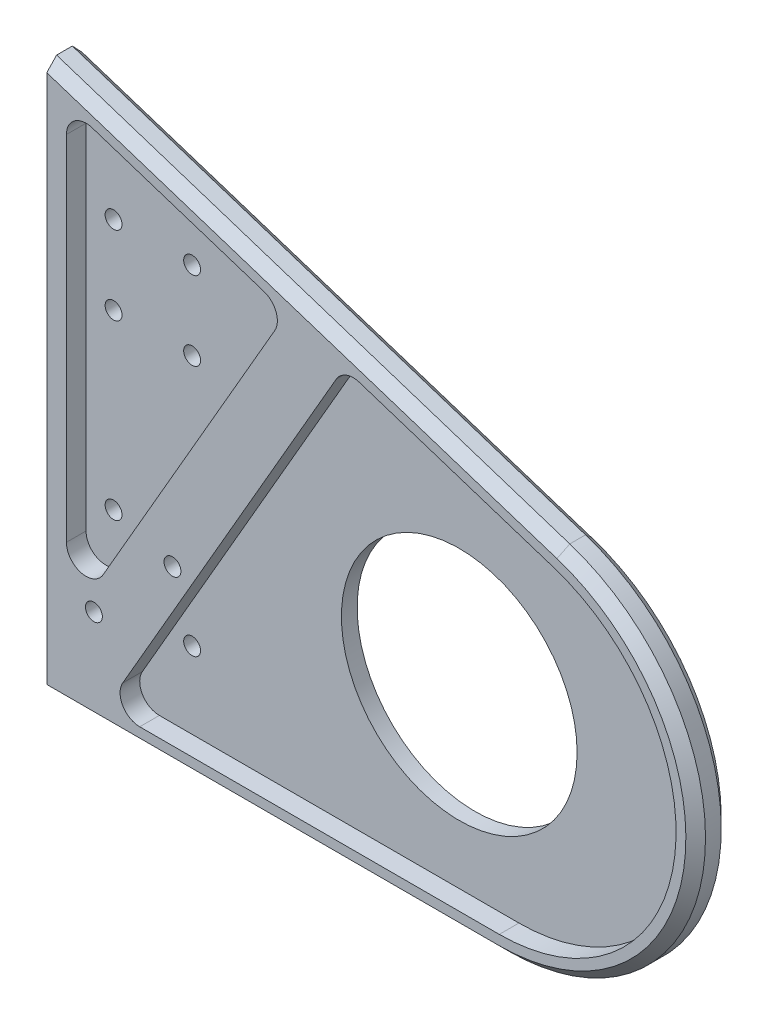
ISO-10303-21;
HEADER;
FILE_DESCRIPTION(('STEP AP214'),'2;1');
FILE_NAME('part.step','',(''),(''),'','','');
FILE_SCHEMA(('AUTOMOTIVE_DESIGN { 1 0 10303 214 1 1 1 1 }'));
ENDSEC;
DATA;
#1=APPLICATION_CONTEXT('core data for automotive mechanical design processes');
#2=APPLICATION_PROTOCOL_DEFINITION('international standard','automotive_design',2000,#1);
#3=PRODUCT_CONTEXT('',#1,'mechanical');
#4=PRODUCT('Part','Part','',(#3));
#5=PRODUCT_RELATED_PRODUCT_CATEGORY('part','',(#4));
#6=PRODUCT_DEFINITION_FORMATION('','',#4);
#7=PRODUCT_DEFINITION_CONTEXT('part definition',#1,'design');
#8=PRODUCT_DEFINITION('design','',#6,#7);
#9=PRODUCT_DEFINITION_SHAPE('','',#8);
#10=(LENGTH_UNIT() NAMED_UNIT(*) SI_UNIT(.MILLI.,.METRE.));
#11=(NAMED_UNIT(*) PLANE_ANGLE_UNIT() SI_UNIT($,.RADIAN.));
#12=(NAMED_UNIT(*) SI_UNIT($,.STERADIAN.) SOLID_ANGLE_UNIT());
#13=UNCERTAINTY_MEASURE_WITH_UNIT(LENGTH_MEASURE(1.E-05),#10,'distance_accuracy_value','');
#14=(GEOMETRIC_REPRESENTATION_CONTEXT(3) GLOBAL_UNCERTAINTY_ASSIGNED_CONTEXT((#13)) GLOBAL_UNIT_ASSIGNED_CONTEXT((#10,
#11,#12)) REPRESENTATION_CONTEXT('',''));
#15=CARTESIAN_POINT('',(0.,0.,0.));
#16=DIRECTION('',(0.,0.,1.));
#17=DIRECTION('',(1.,0.,0.));
#18=AXIS2_PLACEMENT_3D('',#15,#16,#17);
#19=CARTESIAN_POINT('',(0.,0.,8.));
#20=DIRECTION('',(0.,0.,-1.));
#21=DIRECTION('',(-1.,0.,0.));
#22=AXIS2_PLACEMENT_3D('',#19,#20,#21);
#23=PLANE('',#22);
#24=CARTESIAN_POINT('',(64.,49.,8.));
#25=DIRECTION('',(0.,0.,-1.));
#26=DIRECTION('',(-1.,0.,0.));
#27=AXIS2_PLACEMENT_3D('',#24,#25,#26);
#28=CIRCLE('',#27,4.3);
#29=CARTESIAN_POINT('',(59.7,49.,8.));
#30=VERTEX_POINT('',#29);
#31=EDGE_CURVE('E340',#30,#30,#28,.T.);
#32=ORIENTED_EDGE('',*,*,#31,.T.);
#33=EDGE_LOOP('',(#32));
#34=FACE_BOUND('',#33,.T.);
#35=DIRECTION('',(-0.499999999999998,-0.86602540378444,0.));
#36=VECTOR('',#35,1.);
#37=CARTESIAN_POINT('',(30.,10.,8.));
#38=LINE('',#37,#36);
#39=CARTESIAN_POINT('',(147.361565015534,213.276193462705,8.));
#40=VERTEX_POINT('',#39);
#41=CARTESIAN_POINT('',(38.6602540378444,25.,8.));
#42=VERTEX_POINT('',#41);
#43=EDGE_CURVE('E208',#40,#42,#38,.T.);
#44=ORIENTED_EDGE('',*,*,#43,.T.);
#45=CARTESIAN_POINT('',(47.3205080756888,20.,8.));
#46=DIRECTION('',(0.,0.,-1.));
#47=DIRECTION('',(-1.,0.,0.));
#48=AXIS2_PLACEMENT_3D('',#45,#46,#47);
#49=CIRCLE('',#48,10.);
#50=CARTESIAN_POINT('',(47.3205080756887,10.,8.));
#51=VERTEX_POINT('',#50);
#52=EDGE_CURVE('E283',#42,#51,#49,.F.);
#53=ORIENTED_EDGE('',*,*,#52,.T.);
#54=DIRECTION('',(1.,0.,0.));
#55=VECTOR('',#54,1.);
#56=CARTESIAN_POINT('',(30.,10.,8.));
#57=LINE('',#56,#55);
#58=CARTESIAN_POINT('',(230.376238941563,10.,8.));
#59=VERTEX_POINT('',#58);
#60=EDGE_CURVE('E211',#51,#59,#57,.T.);
#61=ORIENTED_EDGE('',*,*,#60,.T.);
#62=CARTESIAN_POINT('',(230.376238941563,100.,8.));
#63=DIRECTION('',(0.,0.,1.));
#64=DIRECTION('',(1.,0.,0.));
#65=AXIS2_PLACEMENT_3D('',#62,#63,#64);
#66=CIRCLE('',#65,90.);
#67=CARTESIAN_POINT('',(258.187768435309,185.595086466564,8.));
#68=VERTEX_POINT('',#67);
#69=EDGE_CURVE('E197',#59,#68,#66,.T.);
#70=ORIENTED_EDGE('',*,*,#69,.T.);
#71=DIRECTION('',(-0.951056516295152,0.309016994374952,0.));
#72=VECTOR('',#71,1.);
#73=CARTESIAN_POINT('',(151.410485181509,220.289128905964,8.));
#74=LINE('',#73,#72);
#75=CARTESIAN_POINT('',(159.111988997128,217.786758625656,8.));
#76=VERTEX_POINT('',#75);
#77=EDGE_CURVE('E215',#68,#76,#74,.T.);
#78=ORIENTED_EDGE('',*,*,#77,.T.);
#79=CARTESIAN_POINT('',(156.021819053379,208.276193462705,8.));
#80=DIRECTION('',(0.,0.,-1.));
#81=DIRECTION('',(-1.,0.,0.));
#82=AXIS2_PLACEMENT_3D('',#79,#80,#81);
#83=CIRCLE('',#82,10.);
#84=EDGE_CURVE('E281',#76,#40,#83,.F.);
#85=ORIENTED_EDGE('',*,*,#84,.T.);
#86=EDGE_LOOP('',(#44,#53,#61,#70,#78,#85));
#87=FACE_BOUND('',#86,.T.);
#88=CARTESIAN_POINT('',(200.,99.9999999999999,8.));
#89=DIRECTION('',(0.,0.,1.));
#90=DIRECTION('',(1.,0.,0.));
#91=AXIS2_PLACEMENT_3D('',#88,#89,#90);
#92=CIRCLE('',#91,60.);
#93=CARTESIAN_POINT('',(260.,99.9999999999999,8.));
#94=VERTEX_POINT('',#93);
#95=EDGE_CURVE('E240',#94,#94,#92,.T.);
#96=ORIENTED_EDGE('',*,*,#95,.F.);
#97=EDGE_LOOP('',(#96));
#98=FACE_BOUND('',#97,.T.);
#99=ADVANCED_FACE('F37',(#34,#87,#98),#23,.F.);
#100=CARTESIAN_POINT('',(0.,0.,0.));
#101=DIRECTION('',(0.,0.,-1.));
#102=DIRECTION('',(-1.,0.,0.));
#103=AXIS2_PLACEMENT_3D('',#100,#101,#102);
#104=PLANE('',#103);
#105=CARTESIAN_POINT('',(64.,89.,0.));
#106=DIRECTION('',(0.,0.,-1.));
#107=DIRECTION('',(-1.,0.,0.));
#108=AXIS2_PLACEMENT_3D('',#105,#106,#107);
#109=CIRCLE('',#108,4.3);
#110=CARTESIAN_POINT('',(59.7,89.,0.));
#111=VERTEX_POINT('',#110);
#112=EDGE_CURVE('E711',#111,#111,#109,.T.);
#113=ORIENTED_EDGE('',*,*,#112,.F.);
#114=EDGE_LOOP('',(#113));
#115=FACE_BOUND('',#114,.T.);
#116=CARTESIAN_POINT('',(24.,177.,0.));
#117=DIRECTION('',(0.,0.,-1.));
#118=DIRECTION('',(-1.,0.,0.));
#119=AXIS2_PLACEMENT_3D('',#116,#117,#118);
#120=CIRCLE('',#119,4.3);
#121=CARTESIAN_POINT('',(19.7,177.,0.));
#122=VERTEX_POINT('',#121);
#123=EDGE_CURVE('E718',#122,#122,#120,.T.);
#124=ORIENTED_EDGE('',*,*,#123,.F.);
#125=EDGE_LOOP('',(#124));
#126=FACE_BOUND('',#125,.T.);
#127=CARTESIAN_POINT('',(24.,217.,0.));
#128=DIRECTION('',(0.,0.,-1.));
#129=DIRECTION('',(-1.,0.,0.));
#130=AXIS2_PLACEMENT_3D('',#127,#128,#129);
#131=CIRCLE('',#130,4.3);
#132=CARTESIAN_POINT('',(19.7,217.,0.));
#133=VERTEX_POINT('',#132);
#134=EDGE_CURVE('E721',#133,#133,#131,.T.);
#135=ORIENTED_EDGE('',*,*,#134,.F.);
#136=EDGE_LOOP('',(#135));
#137=FACE_BOUND('',#136,.T.);
#138=CARTESIAN_POINT('',(64.,177.,0.));
#139=DIRECTION('',(0.,0.,-1.));
#140=DIRECTION('',(-1.,0.,0.));
#141=AXIS2_PLACEMENT_3D('',#138,#139,#140);
#142=CIRCLE('',#141,4.3);
#143=CARTESIAN_POINT('',(59.7,177.,0.));
#144=VERTEX_POINT('',#143);
#145=EDGE_CURVE('E727',#144,#144,#142,.T.);
#146=ORIENTED_EDGE('',*,*,#145,.F.);
#147=EDGE_LOOP('',(#146));
#148=FACE_BOUND('',#147,.T.);
#149=CARTESIAN_POINT('',(24.,49.,0.));
#150=DIRECTION('',(0.,0.,-1.));
#151=DIRECTION('',(-1.,0.,0.));
#152=AXIS2_PLACEMENT_3D('',#149,#150,#151);
#153=CIRCLE('',#152,4.3);
#154=CARTESIAN_POINT('',(19.7,49.,0.));
#155=VERTEX_POINT('',#154);
#156=EDGE_CURVE('E714',#155,#155,#153,.T.);
#157=ORIENTED_EDGE('',*,*,#156,.F.);
#158=EDGE_LOOP('',(#157));
#159=FACE_BOUND('',#158,.T.);
#160=CARTESIAN_POINT('',(64.,49.,0.));
#161=DIRECTION('',(0.,0.,-1.));
#162=DIRECTION('',(-1.,0.,0.));
#163=AXIS2_PLACEMENT_3D('',#160,#161,#162);
#164=CIRCLE('',#163,4.3);
#165=CARTESIAN_POINT('',(59.7,49.,0.));
#166=VERTEX_POINT('',#165);
#167=EDGE_CURVE('E705',#166,#166,#164,.T.);
#168=ORIENTED_EDGE('',*,*,#167,.F.);
#169=EDGE_LOOP('',(#168));
#170=FACE_BOUND('',#169,.T.);
#171=CARTESIAN_POINT('',(24.,89.,0.));
#172=DIRECTION('',(0.,0.,-1.));
#173=DIRECTION('',(-1.,0.,0.));
#174=AXIS2_PLACEMENT_3D('',#171,#172,#173);
#175=CIRCLE('',#174,4.3);
#176=CARTESIAN_POINT('',(19.7,89.,0.));
#177=VERTEX_POINT('',#176);
#178=EDGE_CURVE('E707',#177,#177,#175,.T.);
#179=ORIENTED_EDGE('',*,*,#178,.F.);
#180=EDGE_LOOP('',(#179));
#181=FACE_BOUND('',#180,.T.);
#182=CARTESIAN_POINT('',(64.,217.,0.));
#183=DIRECTION('',(0.,0.,-1.));
#184=DIRECTION('',(-1.,0.,0.));
#185=AXIS2_PLACEMENT_3D('',#182,#183,#184);
#186=CIRCLE('',#185,4.3);
#187=CARTESIAN_POINT('',(59.7,217.,0.));
#188=VERTEX_POINT('',#187);
#189=EDGE_CURVE('E347',#188,#188,#186,.T.);
#190=ORIENTED_EDGE('',*,*,#189,.F.);
#191=EDGE_LOOP('',(#190));
#192=FACE_BOUND('',#191,.T.);
#193=DIRECTION('',(0.,-1.,0.));
#194=VECTOR('',#193,1.);
#195=CARTESIAN_POINT('',(0.,0.,0.));
#196=LINE('',#195,#194);
#197=CARTESIAN_POINT('',(0.,274.742688878809,0.));
#198=VERTEX_POINT('',#197);
#199=CARTESIAN_POINT('',(0.,5.,0.));
#200=VERTEX_POINT('',#199);
#201=EDGE_CURVE('E243',#198,#200,#196,.T.);
#202=ORIENTED_EDGE('',*,*,#201,.F.);
#203=DIRECTION('',(0.951056516295152,-0.309016994374951,0.));
#204=VECTOR('',#203,1.);
#205=CARTESIAN_POINT('',(259.732853407183,190.350369048039,0.));
#206=LINE('',#205,#204);
#207=CARTESIAN_POINT('',(259.732853407183,190.350369048039,0.));
#208=VERTEX_POINT('',#207);
#209=EDGE_CURVE('E321',#198,#208,#206,.T.);
#210=ORIENTED_EDGE('',*,*,#209,.T.);
#211=CARTESIAN_POINT('',(230.376238941563,100.,0.));
#212=DIRECTION('',(0.,0.,-1.));
#213=DIRECTION('',(-1.,0.,0.));
#214=AXIS2_PLACEMENT_3D('',#211,#212,#213);
#215=CIRCLE('',#214,95.);
#216=CARTESIAN_POINT('',(230.376238941563,5.,0.));
#217=VERTEX_POINT('',#216);
#218=EDGE_CURVE('E317',#208,#217,#215,.T.);
#219=ORIENTED_EDGE('',*,*,#218,.T.);
#220=DIRECTION('',(-1.,0.,0.));
#221=VECTOR('',#220,1.);
#222=CARTESIAN_POINT('',(0.,5.,0.));
#223=LINE('',#222,#221);
#224=EDGE_CURVE('E319',#217,#200,#223,.T.);
#225=ORIENTED_EDGE('',*,*,#224,.T.);
#226=EDGE_LOOP('',(#202,#210,#219,#225));
#227=FACE_BOUND('',#226,.T.);
#228=CARTESIAN_POINT('',(200.,99.9999999999999,0.));
#229=DIRECTION('',(0.,0.,1.));
#230=DIRECTION('',(1.,0.,0.));
#231=AXIS2_PLACEMENT_3D('',#228,#229,#230);
#232=CIRCLE('',#231,60.);
#233=CARTESIAN_POINT('',(260.,99.9999999999999,0.));
#234=VERTEX_POINT('',#233);
#235=EDGE_CURVE('E239',#234,#234,#232,.T.);
#236=ORIENTED_EDGE('',*,*,#235,.T.);
#237=EDGE_LOOP('',(#236));
#238=FACE_BOUND('',#237,.T.);
#239=ADVANCED_FACE('F396',(#115,#126,#137,#148,#159,#170,#181,#192,#227,#238),#104,.T.);
#240=CARTESIAN_POINT('',(861.751390409059,0.,8.));
#241=DIRECTION('',(0.,1.,0.));
#242=DIRECTION('',(-1.,0.,0.));
#243=AXIS2_PLACEMENT_3D('',#240,#241,#242);
#244=PLANE('',#243);
#245=DIRECTION('',(0.,0.,-1.));
#246=VECTOR('',#245,1.);
#247=CARTESIAN_POINT('',(0.,0.,8.));
#248=LINE('',#247,#246);
#249=CARTESIAN_POINT('',(0.,0.,12.9999999999999));
#250=VERTEX_POINT('',#249);
#251=CARTESIAN_POINT('',(0.,0.,5.00000000000002));
#252=VERTEX_POINT('',#251);
#253=EDGE_CURVE('E248',#250,#252,#248,.T.);
#254=ORIENTED_EDGE('',*,*,#253,.T.);
#255=DIRECTION('',(1.,0.,0.));
#256=VECTOR('',#255,1.);
#257=CARTESIAN_POINT('',(230.376238941563,0.,5.00000000000002));
#258=LINE('',#257,#256);
#259=CARTESIAN_POINT('',(230.376238941563,0.,5.00000000000002));
#260=VERTEX_POINT('',#259);
#261=EDGE_CURVE('E325',#252,#260,#258,.T.);
#262=ORIENTED_EDGE('',*,*,#261,.T.);
#263=DIRECTION('',(0.,0.,-1.));
#264=VECTOR('',#263,1.);
#265=CARTESIAN_POINT('',(230.376238941563,0.,8.));
#266=LINE('',#265,#264);
#267=CARTESIAN_POINT('',(230.376238941563,0.,12.9999999999999));
#268=VERTEX_POINT('',#267);
#269=EDGE_CURVE('E257',#260,#268,#266,.F.);
#270=ORIENTED_EDGE('',*,*,#269,.T.);
#271=DIRECTION('',(-1.,0.,0.));
#272=VECTOR('',#271,1.);
#273=CARTESIAN_POINT('',(0.,0.,12.9999999999999));
#274=LINE('',#273,#272);
#275=EDGE_CURVE('E323',#268,#250,#274,.T.);
#276=ORIENTED_EDGE('',*,*,#275,.T.);
#277=EDGE_LOOP('',(#254,#262,#270,#276));
#278=FACE_BOUND('',#277,.T.);
#279=ADVANCED_FACE('F401',(#278),#244,.F.);
#280=CARTESIAN_POINT('',(0.,280.,8.));
#281=DIRECTION('',(-0.309016994374951,-0.951056516295152,0.));
#282=DIRECTION('',(0.951056516295152,-0.309016994374951,0.));
#283=AXIS2_PLACEMENT_3D('',#280,#281,#282);
#284=PLANE('',#283);
#285=DIRECTION('',(0.,0.,-1.));
#286=VECTOR('',#285,1.);
#287=CARTESIAN_POINT('',(261.277938379058,195.105651629515,8.));
#288=LINE('',#287,#286);
#289=CARTESIAN_POINT('',(261.277938379058,195.105651629515,12.9999999999999));
#290=VERTEX_POINT('',#289);
#291=CARTESIAN_POINT('',(261.277938379058,195.105651629515,5.00000000000002));
#292=VERTEX_POINT('',#291);
#293=EDGE_CURVE('E254',#290,#292,#288,.T.);
#294=ORIENTED_EDGE('',*,*,#293,.T.);
#295=DIRECTION('',(-0.951056516295152,0.309016994374951,0.));
#296=VECTOR('',#295,1.);
#297=CARTESIAN_POINT('',(0.,280.,5.00000000000002));
#298=LINE('',#297,#296);
#299=CARTESIAN_POINT('',(0.,280.,5.00000000000002));
#300=VERTEX_POINT('',#299);
#301=EDGE_CURVE('E306',#292,#300,#298,.T.);
#302=ORIENTED_EDGE('',*,*,#301,.T.);
#303=DIRECTION('',(0.,0.,-1.));
#304=VECTOR('',#303,1.);
#305=CARTESIAN_POINT('',(0.,280.,8.));
#306=LINE('',#305,#304);
#307=CARTESIAN_POINT('',(0.,280.,12.9999999999999));
#308=VERTEX_POINT('',#307);
#309=EDGE_CURVE('E251',#308,#300,#306,.T.);
#310=ORIENTED_EDGE('',*,*,#309,.F.);
#311=DIRECTION('',(0.951056516295152,-0.309016994374951,0.));
#312=VECTOR('',#311,1.);
#313=CARTESIAN_POINT('',(261.277938379058,195.105651629515,12.9999999999999));
#314=LINE('',#313,#312);
#315=EDGE_CURVE('E304',#308,#290,#314,.T.);
#316=ORIENTED_EDGE('',*,*,#315,.T.);
#317=EDGE_LOOP('',(#294,#302,#310,#316));
#318=FACE_BOUND('',#317,.T.);
#319=ADVANCED_FACE('F411',(#318),#284,.F.);
#320=CARTESIAN_POINT('',(0.,0.,8.));
#321=DIRECTION('',(1.,0.,0.));
#322=DIRECTION('',(0.,0.,-1.));
#323=AXIS2_PLACEMENT_3D('',#320,#321,#322);
#324=PLANE('',#323);
#325=ORIENTED_EDGE('',*,*,#309,.T.);
#326=DIRECTION('',(0.,-0.724617040067446,-0.689151757774653));
#327=VECTOR('',#326,1.);
#328=CARTESIAN_POINT('',(0.,280.,5.00000000000002));
#329=LINE('',#328,#327);
#330=EDGE_CURVE('E315',#300,#198,#329,.T.);
#331=ORIENTED_EDGE('',*,*,#330,.T.);
#332=ORIENTED_EDGE('',*,*,#201,.T.);
#333=DIRECTION('',(0.,-0.707106781186547,0.707106781186549));
#334=VECTOR('',#333,1.);
#335=CARTESIAN_POINT('',(0.,0.,5.00000000000002));
#336=LINE('',#335,#334);
#337=EDGE_CURVE('E313',#200,#252,#336,.T.);
#338=ORIENTED_EDGE('',*,*,#337,.T.);
#339=ORIENTED_EDGE('',*,*,#253,.F.);
#340=DIRECTION('',(0.,0.707106781186551,0.707106781186545));
#341=VECTOR('',#340,1.);
#342=CARTESIAN_POINT('',(0.,5.00000000000012,18.));
#343=LINE('',#342,#341);
#344=CARTESIAN_POINT('',(0.,5.00000000000012,18.));
#345=VERTEX_POINT('',#344);
#346=EDGE_CURVE('E311',#250,#345,#343,.T.);
#347=ORIENTED_EDGE('',*,*,#346,.T.);
#348=DIRECTION('',(0.,-1.,0.));
#349=VECTOR('',#348,1.);
#350=CARTESIAN_POINT('',(0.,280.,18.));
#351=LINE('',#350,#349);
#352=CARTESIAN_POINT('',(0.,274.742688878809,18.));
#353=VERTEX_POINT('',#352);
#354=EDGE_CURVE('E229',#353,#345,#351,.T.);
#355=ORIENTED_EDGE('',*,*,#354,.F.);
#356=DIRECTION('',(0.,0.724617040067451,-0.689151757774647));
#357=VECTOR('',#356,1.);
#358=CARTESIAN_POINT('',(0.,230.430825762735,60.1430861657201));
#359=LINE('',#358,#357);
#360=EDGE_CURVE('E309',#353,#308,#359,.T.);
#361=ORIENTED_EDGE('',*,*,#360,.T.);
#362=EDGE_LOOP('',(#325,#331,#332,#338,#339,#347,#355,#361));
#363=FACE_BOUND('',#362,.T.);
#364=ADVANCED_FACE('F408',(#363),#324,.F.);
#365=CARTESIAN_POINT('',(200.,99.9999999999999,8.));
#366=DIRECTION('',(0.,0.,-1.));
#367=DIRECTION('',(-1.,0.,0.));
#368=AXIS2_PLACEMENT_3D('',#365,#366,#367);
#369=CYLINDRICAL_SURFACE('',#368,60.);
#370=ORIENTED_EDGE('',*,*,#95,.T.);
#371=EDGE_LOOP('',(#370));
#372=FACE_BOUND('',#371,.T.);
#373=ORIENTED_EDGE('',*,*,#235,.F.);
#374=EDGE_LOOP('',(#373));
#375=FACE_BOUND('',#374,.T.);
#376=ADVANCED_FACE('F405',(#372,#375),#369,.F.);
#377=CARTESIAN_POINT('',(230.376238941563,100.,8.));
#378=DIRECTION('',(0.,0.,-1.));
#379=DIRECTION('',(-1.,0.,0.));
#380=AXIS2_PLACEMENT_3D('',#377,#378,#379);
#381=CYLINDRICAL_SURFACE('',#380,100.);
#382=ORIENTED_EDGE('',*,*,#269,.F.);
#383=CARTESIAN_POINT('',(230.376238941563,100.,5.00000000000002));
#384=DIRECTION('',(0.,0.,-1.));
#385=DIRECTION('',(-1.,0.,0.));
#386=AXIS2_PLACEMENT_3D('',#383,#384,#385);
#387=CIRCLE('',#386,100.);
#388=EDGE_CURVE('E329',#260,#292,#387,.F.);
#389=ORIENTED_EDGE('',*,*,#388,.T.);
#390=ORIENTED_EDGE('',*,*,#293,.F.);
#391=CARTESIAN_POINT('',(230.376238941563,100.,12.9999999999999));
#392=DIRECTION('',(0.,0.,1.));
#393=DIRECTION('',(1.,0.,0.));
#394=AXIS2_PLACEMENT_3D('',#391,#392,#393);
#395=CIRCLE('',#394,100.);
#396=EDGE_CURVE('E327',#290,#268,#395,.F.);
#397=ORIENTED_EDGE('',*,*,#396,.T.);
#398=EDGE_LOOP('',(#382,#389,#390,#397));
#399=FACE_BOUND('',#398,.T.);
#400=ADVANCED_FACE('F419',(#399),#381,.T.);
#401=CARTESIAN_POINT('',(230.376238941563,100.,18.));
#402=DIRECTION('',(0.,0.,1.));
#403=DIRECTION('',(1.,0.,0.));
#404=AXIS2_PLACEMENT_3D('',#401,#402,#403);
#405=PLANE('',#404);
#406=CARTESIAN_POINT('',(64.,89.,18.));
#407=DIRECTION('',(0.,0.,-1.));
#408=DIRECTION('',(-1.,0.,0.));
#409=AXIS2_PLACEMENT_3D('',#406,#407,#408);
#410=CIRCLE('',#409,4.3);
#411=CARTESIAN_POINT('',(59.7,89.,18.));
#412=VERTEX_POINT('',#411);
#413=EDGE_CURVE('E722',#412,#412,#410,.T.);
#414=ORIENTED_EDGE('',*,*,#413,.T.);
#415=EDGE_LOOP('',(#414));
#416=FACE_BOUND('',#415,.T.);
#417=CARTESIAN_POINT('',(24.,49.,18.));
#418=DIRECTION('',(0.,0.,-1.));
#419=DIRECTION('',(-1.,0.,0.));
#420=AXIS2_PLACEMENT_3D('',#417,#418,#419);
#421=CIRCLE('',#420,4.3);
#422=CARTESIAN_POINT('',(19.7,49.,18.));
#423=VERTEX_POINT('',#422);
#424=EDGE_CURVE('E708',#423,#423,#421,.T.);
#425=ORIENTED_EDGE('',*,*,#424,.T.);
#426=EDGE_LOOP('',(#425));
#427=FACE_BOUND('',#426,.T.);
#428=ORIENTED_EDGE('',*,*,#354,.T.);
#429=DIRECTION('',(1.,0.,0.));
#430=VECTOR('',#429,1.);
#431=CARTESIAN_POINT('',(230.376238941563,5.00000000000012,18.));
#432=LINE('',#431,#430);
#433=CARTESIAN_POINT('',(230.376238941563,5.0000000000001,18.));
#434=VERTEX_POINT('',#433);
#435=EDGE_CURVE('E11',#345,#434,#432,.T.);
#436=ORIENTED_EDGE('',*,*,#435,.T.);
#437=CARTESIAN_POINT('',(230.376238941563,100.,18.));
#438=DIRECTION('',(0.,0.,1.));
#439=DIRECTION('',(1.,0.,0.));
#440=AXIS2_PLACEMENT_3D('',#437,#438,#439);
#441=CIRCLE('',#440,94.9999999999999);
#442=CARTESIAN_POINT('',(259.732853407183,190.350369048039,18.));
#443=VERTEX_POINT('',#442);
#444=EDGE_CURVE('E54',#434,#443,#441,.T.);
#445=ORIENTED_EDGE('',*,*,#444,.T.);
#446=DIRECTION('',(-0.951056516295152,0.309016994374951,0.));
#447=VECTOR('',#446,1.);
#448=CARTESIAN_POINT('',(-1.54508497187479,275.244717418524,18.));
#449=LINE('',#448,#447);
#450=EDGE_CURVE('E47',#443,#353,#449,.T.);
#451=ORIENTED_EDGE('',*,*,#450,.T.);
#452=EDGE_LOOP('',(#428,#436,#445,#451));
#453=FACE_BOUND('',#452,.T.);
#454=DIRECTION('',(0.,-1.,0.));
#455=VECTOR('',#454,1.);
#456=CARTESIAN_POINT('',(10.,266.236180795288,18.));
#457=LINE('',#456,#455);
#458=CARTESIAN_POINT('',(10.,252.472361590576,18.));
#459=VERTEX_POINT('',#458);
#460=CARTESIAN_POINT('',(10.,72.6794919243115,18.));
#461=VERTEX_POINT('',#460);
#462=EDGE_CURVE('E222',#459,#461,#457,.T.);
#463=ORIENTED_EDGE('',*,*,#462,.F.);
#464=CARTESIAN_POINT('',(20.,252.472361590576,18.));
#465=DIRECTION('',(0.,0.,1.));
#466=DIRECTION('',(1.,0.,0.));
#467=AXIS2_PLACEMENT_3D('',#464,#465,#466);
#468=CIRCLE('',#467,10.);
#469=CARTESIAN_POINT('',(23.0901699437495,261.982926753528,18.));
#470=VERTEX_POINT('',#469);
#471=EDGE_CURVE('E302',#459,#470,#468,.F.);
#472=ORIENTED_EDGE('',*,*,#471,.T.);
#473=DIRECTION('',(-0.951056516295152,0.309016994374951,0.));
#474=VECTOR('',#473,1.);
#475=CARTESIAN_POINT('',(10.,266.236180795288,18.));
#476=LINE('',#475,#474);
#477=CARTESIAN_POINT('',(110.496804766156,233.582789518291,18.));
#478=VERTEX_POINT('',#477);
#479=EDGE_CURVE('E219',#478,#470,#476,.T.);
#480=ORIENTED_EDGE('',*,*,#479,.F.);
#481=CARTESIAN_POINT('',(107.406634822406,224.072224355339,18.));
#482=DIRECTION('',(0.,0.,1.));
#483=DIRECTION('',(1.,0.,0.));
#484=AXIS2_PLACEMENT_3D('',#481,#482,#483);
#485=CIRCLE('',#484,10.);
#486=CARTESIAN_POINT('',(116.066888860251,219.072224355339,18.));
#487=VERTEX_POINT('',#486);
#488=EDGE_CURVE('E298',#478,#487,#485,.F.);
#489=ORIENTED_EDGE('',*,*,#488,.T.);
#490=DIRECTION('',(0.499999999999998,0.86602540378444,0.));
#491=VECTOR('',#490,1.);
#492=CARTESIAN_POINT('',(10.,35.3589838486225,18.));
#493=LINE('',#492,#491);
#494=CARTESIAN_POINT('',(28.6602540378444,67.6794919243115,18.));
#495=VERTEX_POINT('',#494);
#496=EDGE_CURVE('E226',#495,#487,#493,.T.);
#497=ORIENTED_EDGE('',*,*,#496,.F.);
#498=CARTESIAN_POINT('',(20.,72.6794919243115,18.));
#499=DIRECTION('',(0.,0.,1.));
#500=DIRECTION('',(1.,0.,0.));
#501=AXIS2_PLACEMENT_3D('',#498,#499,#500);
#502=CIRCLE('',#501,10.);
#503=EDGE_CURVE('E294',#495,#461,#502,.F.);
#504=ORIENTED_EDGE('',*,*,#503,.T.);
#505=EDGE_LOOP('',(#463,#472,#480,#489,#497,#504));
#506=FACE_BOUND('',#505,.T.);
#507=DIRECTION('',(1.,0.,0.));
#508=VECTOR('',#507,1.);
#509=CARTESIAN_POINT('',(30.,10.,18.));
#510=LINE('',#509,#508);
#511=CARTESIAN_POINT('',(47.3205080756887,10.,18.));
#512=VERTEX_POINT('',#511);
#513=CARTESIAN_POINT('',(230.376238941563,10.,18.));
#514=VERTEX_POINT('',#513);
#515=EDGE_CURVE('E178',#512,#514,#510,.T.);
#516=ORIENTED_EDGE('',*,*,#515,.F.);
#517=CARTESIAN_POINT('',(47.3205080756888,20.,18.));
#518=DIRECTION('',(0.,0.,1.));
#519=DIRECTION('',(1.,0.,0.));
#520=AXIS2_PLACEMENT_3D('',#517,#518,#519);
#521=CIRCLE('',#520,10.);
#522=CARTESIAN_POINT('',(38.6602540378444,25.,18.));
#523=VERTEX_POINT('',#522);
#524=EDGE_CURVE('E296',#512,#523,#521,.F.);
#525=ORIENTED_EDGE('',*,*,#524,.T.);
#526=DIRECTION('',(-0.499999999999998,-0.86602540378444,0.));
#527=VECTOR('',#526,1.);
#528=CARTESIAN_POINT('',(30.,10.,18.));
#529=LINE('',#528,#527);
#530=CARTESIAN_POINT('',(147.361565015534,213.276193462705,18.));
#531=VERTEX_POINT('',#530);
#532=EDGE_CURVE('E190',#531,#523,#529,.T.);
#533=ORIENTED_EDGE('',*,*,#532,.F.);
#534=CARTESIAN_POINT('',(156.021819053379,208.276193462705,18.));
#535=DIRECTION('',(0.,0.,1.));
#536=DIRECTION('',(1.,0.,0.));
#537=AXIS2_PLACEMENT_3D('',#534,#535,#536);
#538=CIRCLE('',#537,10.);
#539=CARTESIAN_POINT('',(159.111988997128,217.786758625656,18.));
#540=VERTEX_POINT('',#539);
#541=EDGE_CURVE('E300',#531,#540,#538,.F.);
#542=ORIENTED_EDGE('',*,*,#541,.T.);
#543=DIRECTION('',(-0.951056516295152,0.309016994374952,0.));
#544=VECTOR('',#543,1.);
#545=CARTESIAN_POINT('',(151.410485181509,220.289128905964,18.));
#546=LINE('',#545,#544);
#547=CARTESIAN_POINT('',(258.187768435309,185.595086466564,18.));
#548=VERTEX_POINT('',#547);
#549=EDGE_CURVE('E203',#548,#540,#546,.T.);
#550=ORIENTED_EDGE('',*,*,#549,.F.);
#551=CARTESIAN_POINT('',(230.376238941563,100.,18.));
#552=DIRECTION('',(0.,0.,1.));
#553=DIRECTION('',(1.,0.,0.));
#554=AXIS2_PLACEMENT_3D('',#551,#552,#553);
#555=CIRCLE('',#554,90.);
#556=EDGE_CURVE('E189',#514,#548,#555,.T.);
#557=ORIENTED_EDGE('',*,*,#556,.F.);
#558=EDGE_LOOP('',(#516,#525,#533,#542,#550,#557));
#559=FACE_BOUND('',#558,.T.);
#560=ADVANCED_FACE('F201',(#416,#427,#453,#506,#559),#405,.T.);
#561=CARTESIAN_POINT('',(10.,266.236180795288,18.));
#562=DIRECTION('',(-0.309016994374951,-0.951056516295152,0.));
#563=DIRECTION('',(0.951056516295152,-0.309016994374951,0.));
#564=AXIS2_PLACEMENT_3D('',#561,#562,#563);
#565=PLANE('',#564);
#566=DIRECTION('',(-0.951056516295152,0.309016994374951,0.));
#567=VECTOR('',#566,1.);
#568=CARTESIAN_POINT('',(10.,266.236180795288,8.));
#569=LINE('',#568,#567);
#570=CARTESIAN_POINT('',(110.496804766156,233.582789518291,8.));
#571=VERTEX_POINT('',#570);
#572=CARTESIAN_POINT('',(23.0901699437495,261.982926753528,8.));
#573=VERTEX_POINT('',#572);
#574=EDGE_CURVE('E198',#571,#573,#569,.T.);
#575=ORIENTED_EDGE('',*,*,#574,.F.);
#576=DIRECTION('',(0.,0.,-1.));
#577=VECTOR('',#576,1.);
#578=CARTESIAN_POINT('',(110.496804766156,233.582789518291,18.));
#579=LINE('',#578,#577);
#580=EDGE_CURVE('E289',#571,#478,#579,.F.);
#581=ORIENTED_EDGE('',*,*,#580,.T.);
#582=ORIENTED_EDGE('',*,*,#479,.T.);
#583=DIRECTION('',(0.,0.,-1.));
#584=VECTOR('',#583,1.);
#585=CARTESIAN_POINT('',(23.0901699437495,261.982926753528,8.));
#586=LINE('',#585,#584);
#587=EDGE_CURVE('E286',#470,#573,#586,.T.);
#588=ORIENTED_EDGE('',*,*,#587,.T.);
#589=EDGE_LOOP('',(#575,#581,#582,#588));
#590=FACE_BOUND('',#589,.T.);
#591=ADVANCED_FACE('F520',(#590),#565,.T.);
#592=CARTESIAN_POINT('',(10.,266.236180795288,18.));
#593=DIRECTION('',(1.,0.,0.));
#594=DIRECTION('',(0.,1.,0.));
#595=AXIS2_PLACEMENT_3D('',#592,#593,#594);
#596=PLANE('',#595);
#597=ORIENTED_EDGE('',*,*,#462,.T.);
#598=DIRECTION('',(0.,0.,-1.));
#599=VECTOR('',#598,1.);
#600=CARTESIAN_POINT('',(10.,72.6794919243115,8.));
#601=LINE('',#600,#599);
#602=CARTESIAN_POINT('',(10.,72.6794919243115,8.));
#603=VERTEX_POINT('',#602);
#604=EDGE_CURVE('E262',#461,#603,#601,.T.);
#605=ORIENTED_EDGE('',*,*,#604,.T.);
#606=DIRECTION('',(0.,-1.,0.));
#607=VECTOR('',#606,1.);
#608=CARTESIAN_POINT('',(10.,266.236180795288,8.));
#609=LINE('',#608,#607);
#610=CARTESIAN_POINT('',(10.,252.472361590576,8.));
#611=VERTEX_POINT('',#610);
#612=EDGE_CURVE('E232',#611,#603,#609,.T.);
#613=ORIENTED_EDGE('',*,*,#612,.F.);
#614=DIRECTION('',(0.,0.,-1.));
#615=VECTOR('',#614,1.);
#616=CARTESIAN_POINT('',(10.,252.472361590576,18.));
#617=LINE('',#616,#615);
#618=EDGE_CURVE('E260',#611,#459,#617,.F.);
#619=ORIENTED_EDGE('',*,*,#618,.T.);
#620=EDGE_LOOP('',(#597,#605,#613,#619));
#621=FACE_BOUND('',#620,.T.);
#622=ADVANCED_FACE('F529',(#621),#596,.T.);
#623=CARTESIAN_POINT('',(10.,35.3589838486225,18.));
#624=DIRECTION('',(-0.86602540378444,0.499999999999998,0.));
#625=DIRECTION('',(-0.499999999999998,-0.86602540378444,0.));
#626=AXIS2_PLACEMENT_3D('',#623,#624,#625);
#627=PLANE('',#626);
#628=DIRECTION('',(0.499999999999998,0.86602540378444,0.));
#629=VECTOR('',#628,1.);
#630=CARTESIAN_POINT('',(10.,35.3589838486225,8.));
#631=LINE('',#630,#629);
#632=CARTESIAN_POINT('',(28.6602540378444,67.6794919243115,8.));
#633=VERTEX_POINT('',#632);
#634=CARTESIAN_POINT('',(116.066888860251,219.072224355339,8.));
#635=VERTEX_POINT('',#634);
#636=EDGE_CURVE('E223',#633,#635,#631,.T.);
#637=ORIENTED_EDGE('',*,*,#636,.F.);
#638=DIRECTION('',(0.,0.,-1.));
#639=VECTOR('',#638,1.);
#640=CARTESIAN_POINT('',(28.6602540378444,67.6794919243115,18.));
#641=LINE('',#640,#639);
#642=EDGE_CURVE('E274',#633,#495,#641,.F.);
#643=ORIENTED_EDGE('',*,*,#642,.T.);
#644=ORIENTED_EDGE('',*,*,#496,.T.);
#645=DIRECTION('',(0.,0.,-1.));
#646=VECTOR('',#645,1.);
#647=CARTESIAN_POINT('',(116.066888860251,219.072224355339,8.));
#648=LINE('',#647,#646);
#649=EDGE_CURVE('E271',#487,#635,#648,.T.);
#650=ORIENTED_EDGE('',*,*,#649,.T.);
#651=EDGE_LOOP('',(#637,#643,#644,#650));
#652=FACE_BOUND('',#651,.T.);
#653=ADVANCED_FACE('F536',(#652),#627,.T.);
#654=CARTESIAN_POINT('',(30.,10.,18.));
#655=DIRECTION('',(0.86602540378444,-0.499999999999998,0.));
#656=DIRECTION('',(0.499999999999998,0.86602540378444,0.));
#657=AXIS2_PLACEMENT_3D('',#654,#655,#656);
#658=PLANE('',#657);
#659=ORIENTED_EDGE('',*,*,#532,.T.);
#660=DIRECTION('',(0.,0.,-1.));
#661=VECTOR('',#660,1.);
#662=CARTESIAN_POINT('',(38.6602540378444,25.,8.));
#663=LINE('',#662,#661);
#664=EDGE_CURVE('E278',#523,#42,#663,.T.);
#665=ORIENTED_EDGE('',*,*,#664,.T.);
#666=ORIENTED_EDGE('',*,*,#43,.F.);
#667=DIRECTION('',(0.,0.,-1.));
#668=VECTOR('',#667,1.);
#669=CARTESIAN_POINT('',(147.361565015534,213.276193462705,18.));
#670=LINE('',#669,#668);
#671=EDGE_CURVE('E276',#40,#531,#670,.F.);
#672=ORIENTED_EDGE('',*,*,#671,.T.);
#673=EDGE_LOOP('',(#659,#665,#666,#672));
#674=FACE_BOUND('',#673,.T.);
#675=ADVANCED_FACE('F369',(#674),#658,.T.);
#676=CARTESIAN_POINT('',(30.,10.,18.));
#677=DIRECTION('',(0.,1.,0.));
#678=DIRECTION('',(-1.,0.,0.));
#679=AXIS2_PLACEMENT_3D('',#676,#677,#678);
#680=PLANE('',#679);
#681=ORIENTED_EDGE('',*,*,#60,.F.);
#682=DIRECTION('',(0.,0.,-1.));
#683=VECTOR('',#682,1.);
#684=CARTESIAN_POINT('',(47.3205080756888,10.,18.));
#685=LINE('',#684,#683);
#686=EDGE_CURVE('E185',#51,#512,#685,.F.);
#687=ORIENTED_EDGE('',*,*,#686,.T.);
#688=ORIENTED_EDGE('',*,*,#515,.T.);
#689=DIRECTION('',(0.,0.,-1.));
#690=VECTOR('',#689,1.);
#691=CARTESIAN_POINT('',(230.376238941563,10.,18.));
#692=LINE('',#691,#690);
#693=EDGE_CURVE('E182',#514,#59,#692,.T.);
#694=ORIENTED_EDGE('',*,*,#693,.T.);
#695=EDGE_LOOP('',(#681,#687,#688,#694));
#696=FACE_BOUND('',#695,.T.);
#697=ADVANCED_FACE('F181',(#696),#680,.T.);
#698=CARTESIAN_POINT('',(230.376238941563,100.,18.));
#699=DIRECTION('',(0.,0.,-1.));
#700=DIRECTION('',(-1.,0.,0.));
#701=AXIS2_PLACEMENT_3D('',#698,#699,#700);
#702=CYLINDRICAL_SURFACE('',#701,90.);
#703=ORIENTED_EDGE('',*,*,#69,.F.);
#704=ORIENTED_EDGE('',*,*,#693,.F.);
#705=ORIENTED_EDGE('',*,*,#556,.T.);
#706=DIRECTION('',(0.,0.,-1.));
#707=VECTOR('',#706,1.);
#708=CARTESIAN_POINT('',(258.187768435309,185.595086466564,18.));
#709=LINE('',#708,#707);
#710=EDGE_CURVE('E199',#548,#68,#709,.T.);
#711=ORIENTED_EDGE('',*,*,#710,.T.);
#712=EDGE_LOOP('',(#703,#704,#705,#711));
#713=FACE_BOUND('',#712,.T.);
#714=ADVANCED_FACE('F194',(#713),#702,.F.);
#715=CARTESIAN_POINT('',(151.410485181509,220.289128905964,18.));
#716=DIRECTION('',(-0.309016994374952,-0.951056516295152,0.));
#717=DIRECTION('',(0.951056516295152,-0.309016994374952,0.));
#718=AXIS2_PLACEMENT_3D('',#715,#716,#717);
#719=PLANE('',#718);
#720=ORIENTED_EDGE('',*,*,#549,.T.);
#721=DIRECTION('',(0.,0.,-1.));
#722=VECTOR('',#721,1.);
#723=CARTESIAN_POINT('',(159.111988997128,217.786758625656,8.));
#724=LINE('',#723,#722);
#725=EDGE_CURVE('E291',#540,#76,#724,.T.);
#726=ORIENTED_EDGE('',*,*,#725,.T.);
#727=ORIENTED_EDGE('',*,*,#77,.F.);
#728=ORIENTED_EDGE('',*,*,#710,.F.);
#729=EDGE_LOOP('',(#720,#726,#727,#728));
#730=FACE_BOUND('',#729,.T.);
#731=ADVANCED_FACE('F381',(#730),#719,.T.);
#732=CARTESIAN_POINT('',(24.,177.,8.));
#733=DIRECTION('',(0.,0.,-1.));
#734=DIRECTION('',(-1.,0.,0.));
#735=AXIS2_PLACEMENT_3D('',#732,#733,#734);
#736=CIRCLE('',#735,4.3);
#737=CARTESIAN_POINT('',(19.7,177.,8.));
#738=VERTEX_POINT('',#737);
#739=EDGE_CURVE('E42',#738,#738,#736,.T.);
#740=ORIENTED_EDGE('',*,*,#739,.T.);
#741=EDGE_LOOP('',(#740));
#742=FACE_BOUND('',#741,.T.);
#743=CARTESIAN_POINT('',(24.,217.,8.));
#744=DIRECTION('',(0.,0.,-1.));
#745=DIRECTION('',(-1.,0.,0.));
#746=AXIS2_PLACEMENT_3D('',#743,#744,#745);
#747=CIRCLE('',#746,4.3);
#748=CARTESIAN_POINT('',(19.7,217.,8.));
#749=VERTEX_POINT('',#748);
#750=EDGE_CURVE('E352',#749,#749,#747,.T.);
#751=ORIENTED_EDGE('',*,*,#750,.T.);
#752=EDGE_LOOP('',(#751));
#753=FACE_BOUND('',#752,.T.);
#754=CARTESIAN_POINT('',(64.,177.,8.));
#755=DIRECTION('',(0.,0.,-1.));
#756=DIRECTION('',(-1.,0.,0.));
#757=AXIS2_PLACEMENT_3D('',#754,#755,#756);
#758=CIRCLE('',#757,4.3);
#759=CARTESIAN_POINT('',(59.7,177.,8.));
#760=VERTEX_POINT('',#759);
#761=EDGE_CURVE('E350',#760,#760,#758,.T.);
#762=ORIENTED_EDGE('',*,*,#761,.T.);
#763=EDGE_LOOP('',(#762));
#764=FACE_BOUND('',#763,.T.);
#765=CARTESIAN_POINT('',(24.,89.,8.));
#766=DIRECTION('',(0.,0.,-1.));
#767=DIRECTION('',(-1.,0.,0.));
#768=AXIS2_PLACEMENT_3D('',#765,#766,#767);
#769=CIRCLE('',#768,4.3);
#770=CARTESIAN_POINT('',(19.7,89.,8.));
#771=VERTEX_POINT('',#770);
#772=EDGE_CURVE('E346',#771,#771,#769,.T.);
#773=ORIENTED_EDGE('',*,*,#772,.T.);
#774=EDGE_LOOP('',(#773));
#775=FACE_BOUND('',#774,.T.);
#776=CARTESIAN_POINT('',(64.,217.,8.));
#777=DIRECTION('',(0.,0.,-1.));
#778=DIRECTION('',(-1.,0.,0.));
#779=AXIS2_PLACEMENT_3D('',#776,#777,#778);
#780=CIRCLE('',#779,4.3);
#781=CARTESIAN_POINT('',(59.7,217.,8.));
#782=VERTEX_POINT('',#781);
#783=EDGE_CURVE('E343',#782,#782,#780,.T.);
#784=ORIENTED_EDGE('',*,*,#783,.T.);
#785=EDGE_LOOP('',(#784));
#786=FACE_BOUND('',#785,.T.);
#787=ORIENTED_EDGE('',*,*,#612,.T.);
#788=CARTESIAN_POINT('',(20.,72.6794919243115,8.));
#789=DIRECTION('',(0.,0.,-1.));
#790=DIRECTION('',(-1.,0.,0.));
#791=AXIS2_PLACEMENT_3D('',#788,#789,#790);
#792=CIRCLE('',#791,10.);
#793=EDGE_CURVE('E269',#603,#633,#792,.F.);
#794=ORIENTED_EDGE('',*,*,#793,.T.);
#795=ORIENTED_EDGE('',*,*,#636,.T.);
#796=CARTESIAN_POINT('',(107.406634822406,224.072224355339,8.));
#797=DIRECTION('',(0.,0.,-1.));
#798=DIRECTION('',(-1.,0.,0.));
#799=AXIS2_PLACEMENT_3D('',#796,#797,#798);
#800=CIRCLE('',#799,10.);
#801=EDGE_CURVE('E267',#635,#571,#800,.F.);
#802=ORIENTED_EDGE('',*,*,#801,.T.);
#803=ORIENTED_EDGE('',*,*,#574,.T.);
#804=CARTESIAN_POINT('',(20.,252.472361590576,8.));
#805=DIRECTION('',(0.,0.,-1.));
#806=DIRECTION('',(-1.,0.,0.));
#807=AXIS2_PLACEMENT_3D('',#804,#805,#806);
#808=CIRCLE('',#807,10.);
#809=EDGE_CURVE('E265',#573,#611,#808,.F.);
#810=ORIENTED_EDGE('',*,*,#809,.T.);
#811=EDGE_LOOP('',(#787,#794,#795,#802,#803,#810));
#812=FACE_BOUND('',#811,.T.);
#813=ADVANCED_FACE('F384',(#742,#753,#764,#775,#786,#812),#23,.F.);
#814=CARTESIAN_POINT('',(20.,72.6794919243115,18.));
#815=DIRECTION('',(0.,0.,1.));
#816=DIRECTION('',(1.,0.,0.));
#817=AXIS2_PLACEMENT_3D('',#814,#815,#816);
#818=CYLINDRICAL_SURFACE('',#817,10.);
#819=ORIENTED_EDGE('',*,*,#503,.F.);
#820=ORIENTED_EDGE('',*,*,#642,.F.);
#821=ORIENTED_EDGE('',*,*,#793,.F.);
#822=ORIENTED_EDGE('',*,*,#604,.F.);
#823=EDGE_LOOP('',(#819,#820,#821,#822));
#824=FACE_BOUND('',#823,.T.);
#825=ADVANCED_FACE('F391',(#824),#818,.F.);
#826=CARTESIAN_POINT('',(47.3205080756888,20.,18.));
#827=DIRECTION('',(0.,0.,1.));
#828=DIRECTION('',(1.,0.,0.));
#829=AXIS2_PLACEMENT_3D('',#826,#827,#828);
#830=CYLINDRICAL_SURFACE('',#829,10.);
#831=ORIENTED_EDGE('',*,*,#524,.F.);
#832=ORIENTED_EDGE('',*,*,#686,.F.);
#833=ORIENTED_EDGE('',*,*,#52,.F.);
#834=ORIENTED_EDGE('',*,*,#664,.F.);
#835=EDGE_LOOP('',(#831,#832,#833,#834));
#836=FACE_BOUND('',#835,.T.);
#837=ADVANCED_FACE('F374',(#836),#830,.F.);
#838=CARTESIAN_POINT('',(107.406634822406,224.072224355339,18.));
#839=DIRECTION('',(0.,0.,1.));
#840=DIRECTION('',(1.,0.,0.));
#841=AXIS2_PLACEMENT_3D('',#838,#839,#840);
#842=CYLINDRICAL_SURFACE('',#841,10.);
#843=ORIENTED_EDGE('',*,*,#488,.F.);
#844=ORIENTED_EDGE('',*,*,#580,.F.);
#845=ORIENTED_EDGE('',*,*,#801,.F.);
#846=ORIENTED_EDGE('',*,*,#649,.F.);
#847=EDGE_LOOP('',(#843,#844,#845,#846));
#848=FACE_BOUND('',#847,.T.);
#849=ADVANCED_FACE('F428',(#848),#842,.F.);
#850=CARTESIAN_POINT('',(156.021819053379,208.276193462705,18.));
#851=DIRECTION('',(0.,0.,1.));
#852=DIRECTION('',(1.,0.,0.));
#853=AXIS2_PLACEMENT_3D('',#850,#851,#852);
#854=CYLINDRICAL_SURFACE('',#853,10.);
#855=ORIENTED_EDGE('',*,*,#541,.F.);
#856=ORIENTED_EDGE('',*,*,#671,.F.);
#857=ORIENTED_EDGE('',*,*,#84,.F.);
#858=ORIENTED_EDGE('',*,*,#725,.F.);
#859=EDGE_LOOP('',(#855,#856,#857,#858));
#860=FACE_BOUND('',#859,.T.);
#861=ADVANCED_FACE('F378',(#860),#854,.F.);
#862=CARTESIAN_POINT('',(20.,252.472361590576,18.));
#863=DIRECTION('',(0.,0.,1.));
#864=DIRECTION('',(1.,0.,0.));
#865=AXIS2_PLACEMENT_3D('',#862,#863,#864);
#866=CYLINDRICAL_SURFACE('',#865,10.);
#867=ORIENTED_EDGE('',*,*,#471,.F.);
#868=ORIENTED_EDGE('',*,*,#618,.F.);
#869=ORIENTED_EDGE('',*,*,#809,.F.);
#870=ORIENTED_EDGE('',*,*,#587,.F.);
#871=EDGE_LOOP('',(#867,#868,#869,#870));
#872=FACE_BOUND('',#871,.T.);
#873=ADVANCED_FACE('F434',(#872),#866,.F.);
#874=CARTESIAN_POINT('',(861.751390409059,0.,5.00000000000002));
#875=DIRECTION('',(0.,-0.707106781186549,-0.707106781186547));
#876=DIRECTION('',(-1.,0.,0.));
#877=AXIS2_PLACEMENT_3D('',#874,#875,#876);
#878=PLANE('',#877);
#879=ORIENTED_EDGE('',*,*,#337,.F.);
#880=ORIENTED_EDGE('',*,*,#224,.F.);
#881=DIRECTION('',(0.,0.707106781186546,-0.707106781186549));
#882=VECTOR('',#881,1.);
#883=CARTESIAN_POINT('',(230.376238941563,0.,5.00000000000002));
#884=LINE('',#883,#882);
#885=EDGE_CURVE('E212',#260,#217,#884,.T.);
#886=ORIENTED_EDGE('',*,*,#885,.F.);
#887=ORIENTED_EDGE('',*,*,#261,.F.);
#888=EDGE_LOOP('',(#879,#880,#886,#887));
#889=FACE_BOUND('',#888,.T.);
#890=ADVANCED_FACE('F437',(#889),#878,.T.);
#891=CARTESIAN_POINT('',(230.376238941563,100.,0.));
#892=DIRECTION('',(0.,0.,1.));
#893=DIRECTION('',(1.,0.,0.));
#894=AXIS2_PLACEMENT_3D('',#891,#892,#893);
#895=CONICAL_SURFACE('',#894,95.,0.785398163397447);
#896=ORIENTED_EDGE('',*,*,#885,.T.);
#897=ORIENTED_EDGE('',*,*,#218,.F.);
#898=DIRECTION('',(-0.218508012224416,-0.672498511963954,-0.707106781186549));
#899=VECTOR('',#898,1.);
#900=CARTESIAN_POINT('',(261.277938379058,195.105651629515,5.00000000000002));
#901=LINE('',#900,#899);
#902=EDGE_CURVE('E333',#292,#208,#901,.T.);
#903=ORIENTED_EDGE('',*,*,#902,.F.);
#904=ORIENTED_EDGE('',*,*,#388,.F.);
#905=EDGE_LOOP('',(#896,#897,#903,#904));
#906=FACE_BOUND('',#905,.T.);
#907=ADVANCED_FACE('F446',(#906),#895,.T.);
#908=CARTESIAN_POINT('',(0.,280.,5.00000000000002));
#909=DIRECTION('',(0.218508012224414,0.672498511963958,-0.707106781186546));
#910=DIRECTION('',(0.951056516295152,-0.309016994374951,0.));
#911=AXIS2_PLACEMENT_3D('',#908,#909,#910);
#912=PLANE('',#911);
#913=ORIENTED_EDGE('',*,*,#902,.T.);
#914=ORIENTED_EDGE('',*,*,#209,.F.);
#915=ORIENTED_EDGE('',*,*,#330,.F.);
#916=ORIENTED_EDGE('',*,*,#301,.F.);
#917=EDGE_LOOP('',(#913,#914,#915,#916));
#918=FACE_BOUND('',#917,.T.);
#919=ADVANCED_FACE('F440',(#918),#912,.T.);
#920=CARTESIAN_POINT('',(259.732853407183,190.350369048039,18.));
#921=DIRECTION('',(0.218508012224412,0.672498511963953,0.707106781186551));
#922=DIRECTION('',(0.951056516295152,-0.309016994374951,0.));
#923=AXIS2_PLACEMENT_3D('',#920,#921,#922);
#924=PLANE('',#923);
#925=ORIENTED_EDGE('',*,*,#360,.F.);
#926=ORIENTED_EDGE('',*,*,#450,.F.);
#927=DIRECTION('',(-0.218508012224412,-0.672498511963961,0.707106781186543));
#928=VECTOR('',#927,1.);
#929=CARTESIAN_POINT('',(261.277938379058,195.105651629515,12.9999999999999));
#930=LINE('',#929,#928);
#931=EDGE_CURVE('E336',#290,#443,#930,.T.);
#932=ORIENTED_EDGE('',*,*,#931,.F.);
#933=ORIENTED_EDGE('',*,*,#315,.F.);
#934=EDGE_LOOP('',(#925,#926,#932,#933));
#935=FACE_BOUND('',#934,.T.);
#936=ADVANCED_FACE('F40',(#935),#924,.T.);
#937=CARTESIAN_POINT('',(230.376238941563,100.,18.));
#938=DIRECTION('',(0.,0.,-1.));
#939=DIRECTION('',(-1.,0.,0.));
#940=AXIS2_PLACEMENT_3D('',#937,#938,#939);
#941=CONICAL_SURFACE('',#940,94.9999999999999,0.785398163397452);
#942=ORIENTED_EDGE('',*,*,#931,.T.);
#943=ORIENTED_EDGE('',*,*,#444,.F.);
#944=DIRECTION('',(0.,0.707106781186549,0.707106781186545));
#945=VECTOR('',#944,1.);
#946=CARTESIAN_POINT('',(230.376238941563,0.,12.9999999999999));
#947=LINE('',#946,#945);
#948=EDGE_CURVE('E62',#268,#434,#947,.T.);
#949=ORIENTED_EDGE('',*,*,#948,.F.);
#950=ORIENTED_EDGE('',*,*,#396,.F.);
#951=EDGE_LOOP('',(#942,#943,#949,#950));
#952=FACE_BOUND('',#951,.T.);
#953=ADVANCED_FACE('F466',(#952),#941,.T.);
#954=CARTESIAN_POINT('',(230.376238941563,5.00000000000012,18.));
#955=DIRECTION('',(0.,-0.707106781186544,0.70710678118655));
#956=DIRECTION('',(-1.,0.,0.));
#957=AXIS2_PLACEMENT_3D('',#954,#955,#956);
#958=PLANE('',#957);
#959=ORIENTED_EDGE('',*,*,#346,.F.);
#960=ORIENTED_EDGE('',*,*,#275,.F.);
#961=ORIENTED_EDGE('',*,*,#948,.T.);
#962=ORIENTED_EDGE('',*,*,#435,.F.);
#963=EDGE_LOOP('',(#959,#960,#961,#962));
#964=FACE_BOUND('',#963,.T.);
#965=ADVANCED_FACE('F460',(#964),#958,.T.);
#966=CARTESIAN_POINT('',(64.,217.,18.));
#967=DIRECTION('',(0.,0.,-1.));
#968=DIRECTION('',(-1.,0.,0.));
#969=AXIS2_PLACEMENT_3D('',#966,#967,#968);
#970=CYLINDRICAL_SURFACE('',#969,4.3);
#971=ORIENTED_EDGE('',*,*,#189,.T.);
#972=EDGE_LOOP('',(#971));
#973=FACE_BOUND('',#972,.T.);
#974=ORIENTED_EDGE('',*,*,#783,.F.);
#975=EDGE_LOOP('',(#974));
#976=FACE_BOUND('',#975,.T.);
#977=ADVANCED_FACE('F465',(#973,#976),#970,.F.);
#978=CARTESIAN_POINT('',(24.,89.,18.));
#979=DIRECTION('',(0.,0.,-1.));
#980=DIRECTION('',(-1.,0.,0.));
#981=AXIS2_PLACEMENT_3D('',#978,#979,#980);
#982=CYLINDRICAL_SURFACE('',#981,4.3);
#983=ORIENTED_EDGE('',*,*,#178,.T.);
#984=EDGE_LOOP('',(#983));
#985=FACE_BOUND('',#984,.T.);
#986=ORIENTED_EDGE('',*,*,#772,.F.);
#987=EDGE_LOOP('',(#986));
#988=FACE_BOUND('',#987,.T.);
#989=ADVANCED_FACE('F629',(#985,#988),#982,.F.);
#990=CARTESIAN_POINT('',(64.,177.,18.));
#991=DIRECTION('',(0.,0.,-1.));
#992=DIRECTION('',(-1.,0.,0.));
#993=AXIS2_PLACEMENT_3D('',#990,#991,#992);
#994=CYLINDRICAL_SURFACE('',#993,4.3);
#995=ORIENTED_EDGE('',*,*,#145,.T.);
#996=EDGE_LOOP('',(#995));
#997=FACE_BOUND('',#996,.T.);
#998=ORIENTED_EDGE('',*,*,#761,.F.);
#999=EDGE_LOOP('',(#998));
#1000=FACE_BOUND('',#999,.T.);
#1001=ADVANCED_FACE('F637',(#997,#1000),#994,.F.);
#1002=CARTESIAN_POINT('',(24.,217.,18.));
#1003=DIRECTION('',(0.,0.,-1.));
#1004=DIRECTION('',(-1.,0.,0.));
#1005=AXIS2_PLACEMENT_3D('',#1002,#1003,#1004);
#1006=CYLINDRICAL_SURFACE('',#1005,4.3);
#1007=ORIENTED_EDGE('',*,*,#134,.T.);
#1008=EDGE_LOOP('',(#1007));
#1009=FACE_BOUND('',#1008,.T.);
#1010=ORIENTED_EDGE('',*,*,#750,.F.);
#1011=EDGE_LOOP('',(#1010));
#1012=FACE_BOUND('',#1011,.T.);
#1013=ADVANCED_FACE('F646',(#1009,#1012),#1006,.F.);
#1014=CARTESIAN_POINT('',(24.,177.,18.));
#1015=DIRECTION('',(0.,0.,-1.));
#1016=DIRECTION('',(-1.,0.,0.));
#1017=AXIS2_PLACEMENT_3D('',#1014,#1015,#1016);
#1018=CYLINDRICAL_SURFACE('',#1017,4.3);
#1019=ORIENTED_EDGE('',*,*,#123,.T.);
#1020=EDGE_LOOP('',(#1019));
#1021=FACE_BOUND('',#1020,.T.);
#1022=ORIENTED_EDGE('',*,*,#739,.F.);
#1023=EDGE_LOOP('',(#1022));
#1024=FACE_BOUND('',#1023,.T.);
#1025=ADVANCED_FACE('F655',(#1021,#1024),#1018,.F.);
#1026=CARTESIAN_POINT('',(24.,49.,18.));
#1027=DIRECTION('',(0.,0.,-1.));
#1028=DIRECTION('',(-1.,0.,0.));
#1029=AXIS2_PLACEMENT_3D('',#1026,#1027,#1028);
#1030=CYLINDRICAL_SURFACE('',#1029,4.3);
#1031=ORIENTED_EDGE('',*,*,#424,.F.);
#1032=EDGE_LOOP('',(#1031));
#1033=FACE_BOUND('',#1032,.T.);
#1034=ORIENTED_EDGE('',*,*,#156,.T.);
#1035=EDGE_LOOP('',(#1034));
#1036=FACE_BOUND('',#1035,.T.);
#1037=ADVANCED_FACE('F664',(#1033,#1036),#1030,.F.);
#1038=CARTESIAN_POINT('',(64.,89.,18.));
#1039=DIRECTION('',(0.,0.,-1.));
#1040=DIRECTION('',(-1.,0.,0.));
#1041=AXIS2_PLACEMENT_3D('',#1038,#1039,#1040);
#1042=CYLINDRICAL_SURFACE('',#1041,4.3);
#1043=ORIENTED_EDGE('',*,*,#413,.F.);
#1044=EDGE_LOOP('',(#1043));
#1045=FACE_BOUND('',#1044,.T.);
#1046=ORIENTED_EDGE('',*,*,#112,.T.);
#1047=EDGE_LOOP('',(#1046));
#1048=FACE_BOUND('',#1047,.T.);
#1049=ADVANCED_FACE('F673',(#1045,#1048),#1042,.F.);
#1050=CARTESIAN_POINT('',(64.,49.,18.));
#1051=DIRECTION('',(0.,0.,-1.));
#1052=DIRECTION('',(-1.,0.,0.));
#1053=AXIS2_PLACEMENT_3D('',#1050,#1051,#1052);
#1054=CYLINDRICAL_SURFACE('',#1053,4.3);
#1055=ORIENTED_EDGE('',*,*,#167,.T.);
#1056=EDGE_LOOP('',(#1055));
#1057=FACE_BOUND('',#1056,.T.);
#1058=ORIENTED_EDGE('',*,*,#31,.F.);
#1059=EDGE_LOOP('',(#1058));
#1060=FACE_BOUND('',#1059,.T.);
#1061=ADVANCED_FACE('F682',(#1057,#1060),#1054,.F.);
#1062=CLOSED_SHELL('',(#99,#239,#279,#319,#364,#376,#400,#560,#591,#622,#653,#675,#697,#714,
#731,#813,#825,#837,#849,#861,#873,#890,#907,#919,#936,#953,#965,#977,#989,#1001,#1013,#1025,
#1037,#1049,#1061));
#1063=MANIFOLD_SOLID_BREP('B2',#1062);
#1064=ADVANCED_BREP_SHAPE_REPRESENTATION('',(#18,#1063),#14);
#1065=SHAPE_DEFINITION_REPRESENTATION(#9,#1064);
ENDSEC;
END-ISO-10303-21;
